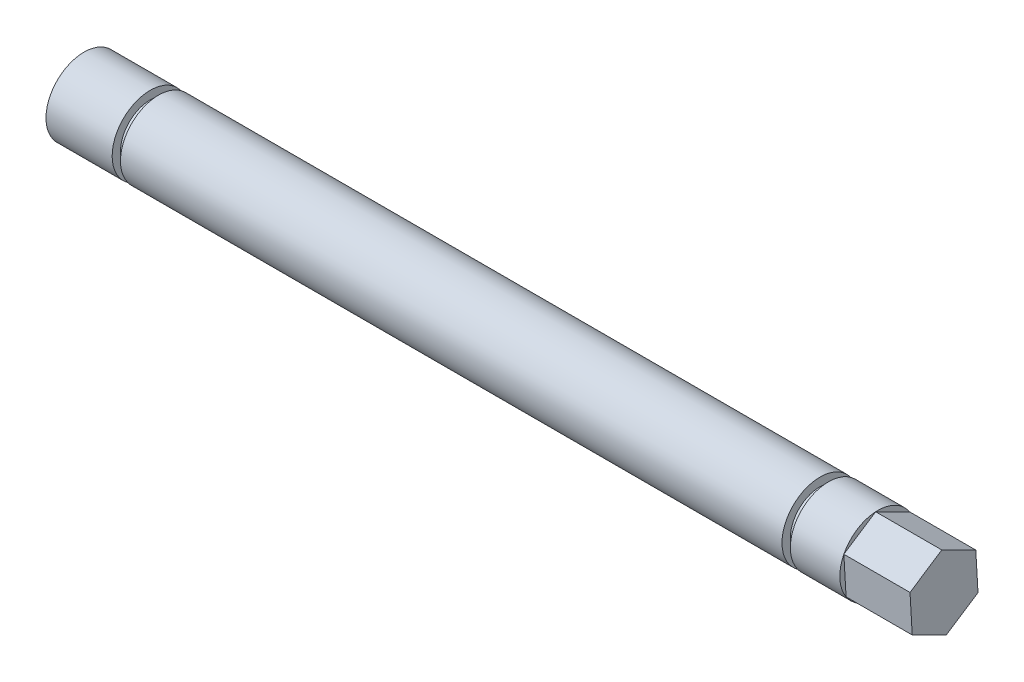
ISO-10303-21;
HEADER;
FILE_DESCRIPTION(('STEP AP214'),'2;1');
FILE_NAME('part.step','',(''),(''),'','','');
FILE_SCHEMA(('AUTOMOTIVE_DESIGN { 1 0 10303 214 1 1 1 1 }'));
ENDSEC;
DATA;
#1=APPLICATION_CONTEXT('core data for automotive mechanical design processes');
#2=APPLICATION_PROTOCOL_DEFINITION('international standard','automotive_design',2000,#1);
#3=PRODUCT_CONTEXT('',#1,'mechanical');
#4=PRODUCT('Part','Part','',(#3));
#5=PRODUCT_RELATED_PRODUCT_CATEGORY('part','',(#4));
#6=PRODUCT_DEFINITION_FORMATION('','',#4);
#7=PRODUCT_DEFINITION_CONTEXT('part definition',#1,'design');
#8=PRODUCT_DEFINITION('design','',#6,#7);
#9=PRODUCT_DEFINITION_SHAPE('','',#8);
#10=(LENGTH_UNIT() NAMED_UNIT(*) SI_UNIT(.MILLI.,.METRE.));
#11=(NAMED_UNIT(*) PLANE_ANGLE_UNIT() SI_UNIT($,.RADIAN.));
#12=(NAMED_UNIT(*) SI_UNIT($,.STERADIAN.) SOLID_ANGLE_UNIT());
#13=UNCERTAINTY_MEASURE_WITH_UNIT(LENGTH_MEASURE(1.E-05),#10,'distance_accuracy_value','');
#14=(GEOMETRIC_REPRESENTATION_CONTEXT(3) GLOBAL_UNCERTAINTY_ASSIGNED_CONTEXT((#13)) GLOBAL_UNIT_ASSIGNED_CONTEXT((#10,
#11,#12)) REPRESENTATION_CONTEXT('',''));
#15=CARTESIAN_POINT('',(0.,0.,0.));
#16=DIRECTION('',(0.,0.,1.));
#17=DIRECTION('',(1.,0.,0.));
#18=AXIS2_PLACEMENT_3D('',#15,#16,#17);
#19=CARTESIAN_POINT('',(165.1,0.,0.));
#20=DIRECTION('',(-1.,0.,0.));
#21=DIRECTION('',(0.,0.,1.));
#22=AXIS2_PLACEMENT_3D('',#19,#20,#21);
#23=CYLINDRICAL_SURFACE('',#22,7.3025);
#24=CARTESIAN_POINT('',(142.9004,0.,0.));
#25=DIRECTION('',(-1.,0.,0.));
#26=DIRECTION('',(0.,0.,1.));
#27=AXIS2_PLACEMENT_3D('',#24,#25,#26);
#28=CIRCLE('',#27,7.3025);
#29=CARTESIAN_POINT('',(142.9004,0.,7.3025));
#30=VERTEX_POINT('',#29);
#31=EDGE_CURVE('E159',#30,#30,#28,.T.);
#32=ORIENTED_EDGE('',*,*,#31,.F.);
#33=EDGE_LOOP('',(#32));
#34=FACE_BOUND('',#33,.T.);
#35=CARTESIAN_POINT('',(152.4,0.,0.));
#36=DIRECTION('',(1.,0.,0.));
#37=DIRECTION('',(0.,0.,-1.));
#38=AXIS2_PLACEMENT_3D('',#35,#36,#37);
#39=CIRCLE('',#38,7.3025);
#40=CARTESIAN_POINT('',(152.4,4.01312582658952,-6.10092840065839));
#41=VERTEX_POINT('',#40);
#42=CARTESIAN_POINT('',(152.4,7.29012189493489,0.425004714080743));
#43=VERTEX_POINT('',#42);
#44=EDGE_CURVE('E13',#41,#43,#39,.T.);
#45=ORIENTED_EDGE('',*,*,#44,.F.);
#46=CARTESIAN_POINT('',(152.4,-3.27699606834539,-6.52593311473914));
#47=VERTEX_POINT('',#46);
#48=EDGE_CURVE('E57',#47,#41,#39,.T.);
#49=ORIENTED_EDGE('',*,*,#48,.F.);
#50=CARTESIAN_POINT('',(152.4,-7.29012189493489,-0.425004714080744));
#51=VERTEX_POINT('',#50);
#52=EDGE_CURVE('E110',#51,#47,#39,.T.);
#53=ORIENTED_EDGE('',*,*,#52,.F.);
#54=CARTESIAN_POINT('',(152.4,-4.01312582658951,6.1009284006584));
#55=VERTEX_POINT('',#54);
#56=EDGE_CURVE('E142',#55,#51,#39,.T.);
#57=ORIENTED_EDGE('',*,*,#56,.F.);
#58=CARTESIAN_POINT('',(152.4,3.27699606834538,6.52593311473914));
#59=VERTEX_POINT('',#58);
#60=EDGE_CURVE('E138',#59,#55,#39,.T.);
#61=ORIENTED_EDGE('',*,*,#60,.F.);
#62=EDGE_CURVE('E52',#43,#59,#39,.T.);
#63=ORIENTED_EDGE('',*,*,#62,.F.);
#64=EDGE_LOOP('',(#45,#49,#53,#57,#61,#63));
#65=FACE_BOUND('',#64,.T.);
#66=ADVANCED_FACE('F48',(#34,#65),#23,.T.);
#67=CARTESIAN_POINT('',(0.,0.,0.));
#68=DIRECTION('',(1.,0.,0.));
#69=DIRECTION('',(0.,0.,-1.));
#70=AXIS2_PLACEMENT_3D('',#67,#68,#69);
#71=CIRCLE('',#70,7.3025);
#72=CARTESIAN_POINT('',(0.,0.,-7.3025));
#73=VERTEX_POINT('',#72);
#74=EDGE_CURVE('E141',#73,#73,#71,.T.);
#75=ORIENTED_EDGE('',*,*,#74,.T.);
#76=EDGE_LOOP('',(#75));
#77=FACE_BOUND('',#76,.T.);
#78=CARTESIAN_POINT('',(12.7,0.,0.));
#79=DIRECTION('',(-1.,0.,0.));
#80=DIRECTION('',(0.,0.,1.));
#81=AXIS2_PLACEMENT_3D('',#78,#79,#80);
#82=CIRCLE('',#81,7.3025);
#83=CARTESIAN_POINT('',(12.7,0.,7.3025));
#84=VERTEX_POINT('',#83);
#85=EDGE_CURVE('E156',#84,#84,#82,.T.);
#86=ORIENTED_EDGE('',*,*,#85,.T.);
#87=EDGE_LOOP('',(#86));
#88=FACE_BOUND('',#87,.T.);
#89=ADVANCED_FACE('F50',(#77,#88),#23,.T.);
#90=CARTESIAN_POINT('',(0.,0.,0.));
#91=DIRECTION('',(1.,0.,0.));
#92=DIRECTION('',(0.,0.,-1.));
#93=AXIS2_PLACEMENT_3D('',#90,#91,#92);
#94=PLANE('',#93);
#95=ORIENTED_EDGE('',*,*,#74,.F.);
#96=EDGE_LOOP('',(#95));
#97=FACE_BOUND('',#96,.T.);
#98=ADVANCED_FACE('F221',(#97),#94,.F.);
#99=CARTESIAN_POINT('',(12.7,7.3025,0.));
#100=DIRECTION('',(1.,0.,0.));
#101=DIRECTION('',(0.,0.,-1.));
#102=AXIS2_PLACEMENT_3D('',#99,#100,#101);
#103=PLANE('',#102);
#104=CARTESIAN_POINT('',(12.7,0.,0.));
#105=DIRECTION('',(-1.,0.,0.));
#106=DIRECTION('',(0.,0.,1.));
#107=AXIS2_PLACEMENT_3D('',#104,#105,#106);
#108=CIRCLE('',#107,5.7023);
#109=CARTESIAN_POINT('',(12.7,0.,5.7023));
#110=VERTEX_POINT('',#109);
#111=EDGE_CURVE('E144',#110,#110,#108,.T.);
#112=ORIENTED_EDGE('',*,*,#111,.T.);
#113=EDGE_LOOP('',(#112));
#114=FACE_BOUND('',#113,.T.);
#115=ORIENTED_EDGE('',*,*,#85,.F.);
#116=EDGE_LOOP('',(#115));
#117=FACE_BOUND('',#116,.T.);
#118=ADVANCED_FACE('F245',(#114,#117),#103,.T.);
#119=CARTESIAN_POINT('',(0.,0.,0.));
#120=DIRECTION('',(-1.,0.,0.));
#121=DIRECTION('',(0.,0.,1.));
#122=AXIS2_PLACEMENT_3D('',#119,#120,#121);
#123=CYLINDRICAL_SURFACE('',#122,5.7023);
#124=CARTESIAN_POINT('',(14.3002,0.,0.));
#125=DIRECTION('',(-1.,0.,0.));
#126=DIRECTION('',(0.,0.,1.));
#127=AXIS2_PLACEMENT_3D('',#124,#125,#126);
#128=CIRCLE('',#127,5.7023);
#129=CARTESIAN_POINT('',(14.3002,0.,5.7023));
#130=VERTEX_POINT('',#129);
#131=EDGE_CURVE('E148',#130,#130,#128,.T.);
#132=ORIENTED_EDGE('',*,*,#131,.T.);
#133=EDGE_LOOP('',(#132));
#134=FACE_BOUND('',#133,.T.);
#135=ORIENTED_EDGE('',*,*,#111,.F.);
#136=EDGE_LOOP('',(#135));
#137=FACE_BOUND('',#136,.T.);
#138=ADVANCED_FACE('F234',(#134,#137),#123,.T.);
#139=CARTESIAN_POINT('',(14.3002,7.3025,0.));
#140=DIRECTION('',(-1.,0.,0.));
#141=DIRECTION('',(0.,0.,1.));
#142=AXIS2_PLACEMENT_3D('',#139,#140,#141);
#143=PLANE('',#142);
#144=CARTESIAN_POINT('',(14.3002,0.,0.));
#145=DIRECTION('',(-1.,0.,0.));
#146=DIRECTION('',(0.,0.,1.));
#147=AXIS2_PLACEMENT_3D('',#144,#145,#146);
#148=CIRCLE('',#147,7.3025);
#149=CARTESIAN_POINT('',(14.3002,0.,7.3025));
#150=VERTEX_POINT('',#149);
#151=EDGE_CURVE('E153',#150,#150,#148,.T.);
#152=ORIENTED_EDGE('',*,*,#151,.T.);
#153=EDGE_LOOP('',(#152));
#154=FACE_BOUND('',#153,.T.);
#155=ORIENTED_EDGE('',*,*,#131,.F.);
#156=EDGE_LOOP('',(#155));
#157=FACE_BOUND('',#156,.T.);
#158=ADVANCED_FACE('F225',(#154,#157),#143,.T.);
#159=CARTESIAN_POINT('',(141.3002,0.,0.));
#160=DIRECTION('',(-1.,0.,0.));
#161=DIRECTION('',(0.,0.,1.));
#162=AXIS2_PLACEMENT_3D('',#159,#160,#161);
#163=CIRCLE('',#162,7.3025);
#164=CARTESIAN_POINT('',(141.3002,0.,7.3025));
#165=VERTEX_POINT('',#164);
#166=EDGE_CURVE('E160',#165,#165,#163,.T.);
#167=ORIENTED_EDGE('',*,*,#166,.T.);
#168=EDGE_LOOP('',(#167));
#169=FACE_BOUND('',#168,.T.);
#170=ORIENTED_EDGE('',*,*,#151,.F.);
#171=EDGE_LOOP('',(#170));
#172=FACE_BOUND('',#171,.T.);
#173=ADVANCED_FACE('F216',(#169,#172),#23,.T.);
#174=CARTESIAN_POINT('',(142.9004,0.,0.));
#175=DIRECTION('',(-1.,0.,0.));
#176=DIRECTION('',(0.,0.,1.));
#177=AXIS2_PLACEMENT_3D('',#174,#175,#176);
#178=PLANE('',#177);
#179=CARTESIAN_POINT('',(142.9004,0.,0.));
#180=DIRECTION('',(-1.,0.,0.));
#181=DIRECTION('',(0.,0.,1.));
#182=AXIS2_PLACEMENT_3D('',#179,#180,#181);
#183=CIRCLE('',#182,5.7023);
#184=CARTESIAN_POINT('',(142.9004,0.,5.7023));
#185=VERTEX_POINT('',#184);
#186=EDGE_CURVE('E163',#185,#185,#183,.T.);
#187=ORIENTED_EDGE('',*,*,#186,.F.);
#188=EDGE_LOOP('',(#187));
#189=FACE_BOUND('',#188,.T.);
#190=ORIENTED_EDGE('',*,*,#31,.T.);
#191=EDGE_LOOP('',(#190));
#192=FACE_BOUND('',#191,.T.);
#193=ADVANCED_FACE('F224',(#189,#192),#178,.T.);
#194=CARTESIAN_POINT('',(141.3002,0.,0.));
#195=DIRECTION('',(-1.,0.,0.));
#196=DIRECTION('',(0.,0.,1.));
#197=AXIS2_PLACEMENT_3D('',#194,#195,#196);
#198=PLANE('',#197);
#199=CARTESIAN_POINT('',(141.3002,0.,0.));
#200=DIRECTION('',(-1.,0.,0.));
#201=DIRECTION('',(0.,0.,1.));
#202=AXIS2_PLACEMENT_3D('',#199,#200,#201);
#203=CIRCLE('',#202,5.7023);
#204=CARTESIAN_POINT('',(141.3002,0.,5.7023));
#205=VERTEX_POINT('',#204);
#206=EDGE_CURVE('E166',#205,#205,#203,.T.);
#207=ORIENTED_EDGE('',*,*,#206,.T.);
#208=EDGE_LOOP('',(#207));
#209=FACE_BOUND('',#208,.T.);
#210=ORIENTED_EDGE('',*,*,#166,.F.);
#211=EDGE_LOOP('',(#210));
#212=FACE_BOUND('',#211,.T.);
#213=ADVANCED_FACE('F231',(#209,#212),#198,.F.);
#214=CARTESIAN_POINT('',(142.9004,0.,0.));
#215=DIRECTION('',(-1.,0.,0.));
#216=DIRECTION('',(0.,0.,1.));
#217=AXIS2_PLACEMENT_3D('',#214,#215,#216);
#218=CYLINDRICAL_SURFACE('',#217,5.7023);
#219=ORIENTED_EDGE('',*,*,#186,.T.);
#220=EDGE_LOOP('',(#219));
#221=FACE_BOUND('',#220,.T.);
#222=ORIENTED_EDGE('',*,*,#206,.F.);
#223=EDGE_LOOP('',(#222));
#224=FACE_BOUND('',#223,.T.);
#225=ADVANCED_FACE('F211',(#221,#224),#218,.T.);
#226=CARTESIAN_POINT('',(152.4,0.,0.));
#227=DIRECTION('',(1.,0.,0.));
#228=DIRECTION('',(0.,0.,-1.));
#229=AXIS2_PLACEMENT_3D('',#226,#227,#228);
#230=PLANE('',#229);
#231=ORIENTED_EDGE('',*,*,#44,.T.);
#232=DIRECTION('',(0.,0.448749889537197,0.893657393322717));
#233=VECTOR('',#232,1.);
#234=CARTESIAN_POINT('',(152.4,4.01312582658952,-6.10092840065839));
#235=LINE('',#234,#233);
#236=EDGE_CURVE('E117',#41,#43,#235,.T.);
#237=ORIENTED_EDGE('',*,*,#236,.F.);
#238=EDGE_LOOP('',(#231,#237));
#239=FACE_BOUND('',#238,.T.);
#240=ADVANCED_FACE('F127',(#239),#230,.T.);
#241=ORIENTED_EDGE('',*,*,#62,.T.);
#242=DIRECTION('',(0.,-0.549555060128657,0.835457500946032));
#243=VECTOR('',#242,1.);
#244=CARTESIAN_POINT('',(152.4,7.2901218949349,0.425004714080743));
#245=LINE('',#244,#243);
#246=EDGE_CURVE('E129',#43,#59,#245,.T.);
#247=ORIENTED_EDGE('',*,*,#246,.F.);
#248=EDGE_LOOP('',(#241,#247));
#249=FACE_BOUND('',#248,.T.);
#250=ADVANCED_FACE('F201',(#249),#230,.T.);
#251=ORIENTED_EDGE('',*,*,#60,.T.);
#252=DIRECTION('',(0.,-0.998304949665853,-0.0581998923766852));
#253=VECTOR('',#252,1.);
#254=CARTESIAN_POINT('',(152.4,3.27699606834538,6.52593311473914));
#255=LINE('',#254,#253);
#256=EDGE_CURVE('E195',#59,#55,#255,.T.);
#257=ORIENTED_EDGE('',*,*,#256,.F.);
#258=EDGE_LOOP('',(#251,#257));
#259=FACE_BOUND('',#258,.T.);
#260=ADVANCED_FACE('F203',(#259),#230,.T.);
#261=ORIENTED_EDGE('',*,*,#56,.T.);
#262=DIRECTION('',(0.,-0.448749889537197,-0.893657393322717));
#263=VECTOR('',#262,1.);
#264=CARTESIAN_POINT('',(152.4,-4.01312582658951,6.1009284006584));
#265=LINE('',#264,#263);
#266=EDGE_CURVE('E192',#55,#51,#265,.T.);
#267=ORIENTED_EDGE('',*,*,#266,.F.);
#268=EDGE_LOOP('',(#261,#267));
#269=FACE_BOUND('',#268,.T.);
#270=ADVANCED_FACE('F209',(#269),#230,.T.);
#271=ORIENTED_EDGE('',*,*,#52,.T.);
#272=DIRECTION('',(0.,0.549555060128657,-0.835457500946032));
#273=VECTOR('',#272,1.);
#274=CARTESIAN_POINT('',(152.4,-7.29012189493489,-0.425004714080744));
#275=LINE('',#274,#273);
#276=EDGE_CURVE('E64',#51,#47,#275,.T.);
#277=ORIENTED_EDGE('',*,*,#276,.F.);
#278=EDGE_LOOP('',(#271,#277));
#279=FACE_BOUND('',#278,.T.);
#280=ADVANCED_FACE('F271',(#279),#230,.T.);
#281=ORIENTED_EDGE('',*,*,#48,.T.);
#282=DIRECTION('',(0.,0.998304949665853,0.0581998923766854));
#283=VECTOR('',#282,1.);
#284=CARTESIAN_POINT('',(152.4,-3.27699606834538,-6.52593311473914));
#285=LINE('',#284,#283);
#286=EDGE_CURVE('E105',#47,#41,#285,.T.);
#287=ORIENTED_EDGE('',*,*,#286,.F.);
#288=EDGE_LOOP('',(#281,#287));
#289=FACE_BOUND('',#288,.T.);
#290=ADVANCED_FACE('F103',(#289),#230,.T.);
#291=CARTESIAN_POINT('',(152.4,-3.27699606834538,-6.52593311473914));
#292=DIRECTION('',(0.,0.0581998923766855,-0.998304949665854));
#293=DIRECTION('',(0.,0.998304949665854,0.0581998923766855));
#294=AXIS2_PLACEMENT_3D('',#291,#292,#293);
#295=PLANE('',#294);
#296=DIRECTION('',(0.,0.998304949665853,0.0581998923766854));
#297=VECTOR('',#296,1.);
#298=CARTESIAN_POINT('',(165.1,-3.27699606834538,-6.52593311473914));
#299=LINE('',#298,#297);
#300=CARTESIAN_POINT('',(165.1,-3.27699606834538,-6.52593311473914));
#301=VERTEX_POINT('',#300);
#302=CARTESIAN_POINT('',(165.1,4.01312582658952,-6.10092840065839));
#303=VERTEX_POINT('',#302);
#304=EDGE_CURVE('E189',#301,#303,#299,.T.);
#305=ORIENTED_EDGE('',*,*,#304,.F.);
#306=DIRECTION('',(1.,0.,0.));
#307=VECTOR('',#306,1.);
#308=CARTESIAN_POINT('',(152.4,-3.27699606834538,-6.52593311473914));
#309=LINE('',#308,#307);
#310=EDGE_CURVE('E132',#47,#301,#309,.T.);
#311=ORIENTED_EDGE('',*,*,#310,.F.);
#312=ORIENTED_EDGE('',*,*,#286,.T.);
#313=DIRECTION('',(1.,0.,0.));
#314=VECTOR('',#313,1.);
#315=CARTESIAN_POINT('',(152.4,4.01312582658952,-6.10092840065839));
#316=LINE('',#315,#314);
#317=EDGE_CURVE('E114',#41,#303,#316,.T.);
#318=ORIENTED_EDGE('',*,*,#317,.T.);
#319=EDGE_LOOP('',(#305,#311,#312,#318));
#320=FACE_BOUND('',#319,.T.);
#321=ADVANCED_FACE('F131',(#320),#295,.T.);
#322=CARTESIAN_POINT('',(152.4,-7.29012189493489,-0.425004714080744));
#323=DIRECTION('',(0.,-0.835457500946032,-0.549555060128657));
#324=DIRECTION('',(0.,0.549555060128657,-0.835457500946032));
#325=AXIS2_PLACEMENT_3D('',#322,#323,#324);
#326=PLANE('',#325);
#327=DIRECTION('',(0.,0.549555060128657,-0.835457500946032));
#328=VECTOR('',#327,1.);
#329=CARTESIAN_POINT('',(165.1,-7.29012189493489,-0.425004714080744));
#330=LINE('',#329,#328);
#331=CARTESIAN_POINT('',(165.1,-7.29012189493489,-0.425004714080744));
#332=VERTEX_POINT('',#331);
#333=EDGE_CURVE('E134',#332,#301,#330,.T.);
#334=ORIENTED_EDGE('',*,*,#333,.F.);
#335=DIRECTION('',(1.,0.,0.));
#336=VECTOR('',#335,1.);
#337=CARTESIAN_POINT('',(152.4,-7.29012189493489,-0.425004714080744));
#338=LINE('',#337,#336);
#339=EDGE_CURVE('E176',#51,#332,#338,.T.);
#340=ORIENTED_EDGE('',*,*,#339,.F.);
#341=ORIENTED_EDGE('',*,*,#276,.T.);
#342=ORIENTED_EDGE('',*,*,#310,.T.);
#343=EDGE_LOOP('',(#334,#340,#341,#342));
#344=FACE_BOUND('',#343,.T.);
#345=ADVANCED_FACE('F268',(#344),#326,.T.);
#346=CARTESIAN_POINT('',(152.4,-4.01312582658951,6.1009284006584));
#347=DIRECTION('',(0.,-0.893657393322717,0.448749889537197));
#348=DIRECTION('',(0.,-0.448749889537197,-0.893657393322717));
#349=AXIS2_PLACEMENT_3D('',#346,#347,#348);
#350=PLANE('',#349);
#351=DIRECTION('',(0.,-0.448749889537197,-0.893657393322717));
#352=VECTOR('',#351,1.);
#353=CARTESIAN_POINT('',(165.1,-4.01312582658951,6.1009284006584));
#354=LINE('',#353,#352);
#355=CARTESIAN_POINT('',(165.1,-4.01312582658951,6.1009284006584));
#356=VERTEX_POINT('',#355);
#357=EDGE_CURVE('E181',#356,#332,#354,.T.);
#358=ORIENTED_EDGE('',*,*,#357,.F.);
#359=DIRECTION('',(1.,0.,0.));
#360=VECTOR('',#359,1.);
#361=CARTESIAN_POINT('',(152.4,-4.01312582658951,6.1009284006584));
#362=LINE('',#361,#360);
#363=EDGE_CURVE('E174',#55,#356,#362,.T.);
#364=ORIENTED_EDGE('',*,*,#363,.F.);
#365=ORIENTED_EDGE('',*,*,#266,.T.);
#366=ORIENTED_EDGE('',*,*,#339,.T.);
#367=EDGE_LOOP('',(#358,#364,#365,#366));
#368=FACE_BOUND('',#367,.T.);
#369=ADVANCED_FACE('F274',(#368),#350,.T.);
#370=CARTESIAN_POINT('',(152.4,3.27699606834538,6.52593311473914));
#371=DIRECTION('',(0.,-0.0581998923766852,0.998304949665853));
#372=DIRECTION('',(0.,-0.998304949665853,-0.0581998923766852));
#373=AXIS2_PLACEMENT_3D('',#370,#371,#372);
#374=PLANE('',#373);
#375=DIRECTION('',(0.,-0.998304949665853,-0.0581998923766852));
#376=VECTOR('',#375,1.);
#377=CARTESIAN_POINT('',(165.1,3.27699606834538,6.52593311473914));
#378=LINE('',#377,#376);
#379=CARTESIAN_POINT('',(165.1,3.27699606834538,6.52593311473914));
#380=VERTEX_POINT('',#379);
#381=EDGE_CURVE('E184',#380,#356,#378,.T.);
#382=ORIENTED_EDGE('',*,*,#381,.F.);
#383=DIRECTION('',(1.,0.,0.));
#384=VECTOR('',#383,1.);
#385=CARTESIAN_POINT('',(152.4,3.27699606834538,6.52593311473914));
#386=LINE('',#385,#384);
#387=EDGE_CURVE('E172',#59,#380,#386,.T.);
#388=ORIENTED_EDGE('',*,*,#387,.F.);
#389=ORIENTED_EDGE('',*,*,#256,.T.);
#390=ORIENTED_EDGE('',*,*,#363,.T.);
#391=EDGE_LOOP('',(#382,#388,#389,#390));
#392=FACE_BOUND('',#391,.T.);
#393=ADVANCED_FACE('F293',(#392),#374,.T.);
#394=CARTESIAN_POINT('',(152.4,7.2901218949349,0.425004714080743));
#395=DIRECTION('',(0.,0.835457500946032,0.549555060128657));
#396=DIRECTION('',(0.,-0.549555060128657,0.835457500946032));
#397=AXIS2_PLACEMENT_3D('',#394,#395,#396);
#398=PLANE('',#397);
#399=DIRECTION('',(0.,-0.549555060128657,0.835457500946032));
#400=VECTOR('',#399,1.);
#401=CARTESIAN_POINT('',(165.1,7.2901218949349,0.425004714080743));
#402=LINE('',#401,#400);
#403=CARTESIAN_POINT('',(165.1,7.29012189493489,0.425004714080744));
#404=VERTEX_POINT('',#403);
#405=EDGE_CURVE('E72',#404,#380,#402,.T.);
#406=ORIENTED_EDGE('',*,*,#405,.F.);
#407=DIRECTION('',(1.,0.,0.));
#408=VECTOR('',#407,1.);
#409=CARTESIAN_POINT('',(152.4,7.2901218949349,0.425004714080743));
#410=LINE('',#409,#408);
#411=EDGE_CURVE('E124',#43,#404,#410,.T.);
#412=ORIENTED_EDGE('',*,*,#411,.F.);
#413=ORIENTED_EDGE('',*,*,#246,.T.);
#414=ORIENTED_EDGE('',*,*,#387,.T.);
#415=EDGE_LOOP('',(#406,#412,#413,#414));
#416=FACE_BOUND('',#415,.T.);
#417=ADVANCED_FACE('F199',(#416),#398,.T.);
#418=CARTESIAN_POINT('',(152.4,4.01312582658952,-6.10092840065839));
#419=DIRECTION('',(0.,0.893657393322717,-0.448749889537197));
#420=DIRECTION('',(0.,0.448749889537197,0.893657393322717));
#421=AXIS2_PLACEMENT_3D('',#418,#419,#420);
#422=PLANE('',#421);
#423=DIRECTION('',(0.,0.448749889537197,0.893657393322717));
#424=VECTOR('',#423,1.);
#425=CARTESIAN_POINT('',(165.1,4.01312582658952,-6.10092840065839));
#426=LINE('',#425,#424);
#427=EDGE_CURVE('E120',#303,#404,#426,.T.);
#428=ORIENTED_EDGE('',*,*,#427,.F.);
#429=ORIENTED_EDGE('',*,*,#317,.F.);
#430=ORIENTED_EDGE('',*,*,#236,.T.);
#431=ORIENTED_EDGE('',*,*,#411,.T.);
#432=EDGE_LOOP('',(#428,#429,#430,#431));
#433=FACE_BOUND('',#432,.T.);
#434=ADVANCED_FACE('F116',(#433),#422,.T.);
#435=CARTESIAN_POINT('',(165.1,0.,0.));
#436=DIRECTION('',(1.,0.,0.));
#437=DIRECTION('',(0.,0.,-1.));
#438=AXIS2_PLACEMENT_3D('',#435,#436,#437);
#439=PLANE('',#438);
#440=ORIENTED_EDGE('',*,*,#333,.T.);
#441=ORIENTED_EDGE('',*,*,#304,.T.);
#442=ORIENTED_EDGE('',*,*,#427,.T.);
#443=ORIENTED_EDGE('',*,*,#405,.T.);
#444=ORIENTED_EDGE('',*,*,#381,.T.);
#445=ORIENTED_EDGE('',*,*,#357,.T.);
#446=EDGE_LOOP('',(#440,#441,#442,#443,#444,#445));
#447=FACE_BOUND('',#446,.T.);
#448=ADVANCED_FACE('F259',(#447),#439,.T.);
#449=CLOSED_SHELL('',(#66,#89,#98,#118,#138,#158,#173,#193,#213,#225,#240,#250,#260,#270,#280,
#290,#321,#345,#369,#393,#417,#434,#448));
#450=MANIFOLD_SOLID_BREP('B2',#449);
#451=ADVANCED_BREP_SHAPE_REPRESENTATION('',(#18,#450),#14);
#452=SHAPE_DEFINITION_REPRESENTATION(#9,#451);
ENDSEC;
END-ISO-10303-21;
